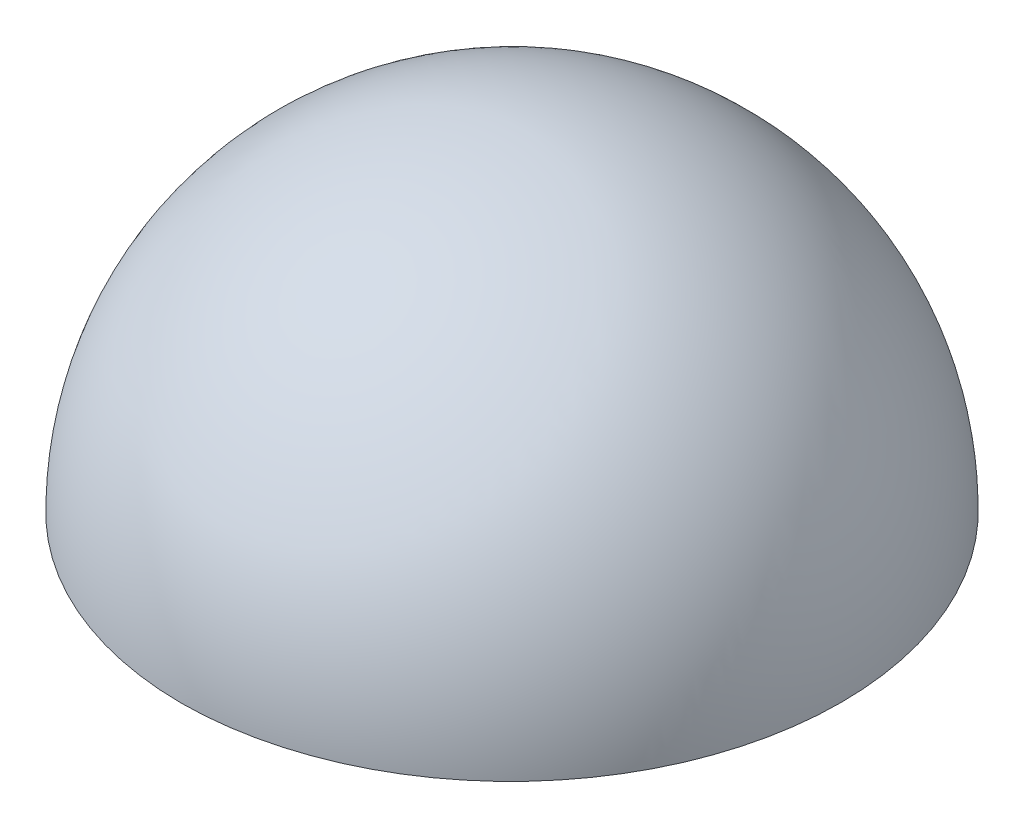
ISO-10303-21;
HEADER;
FILE_DESCRIPTION(('STEP AP214'),'2;1');
FILE_NAME('part.step','',(''),(''),'','','');
FILE_SCHEMA(('AUTOMOTIVE_DESIGN { 1 0 10303 214 1 1 1 1 }'));
ENDSEC;
DATA;
#1=APPLICATION_CONTEXT('core data for automotive mechanical design processes');
#2=APPLICATION_PROTOCOL_DEFINITION('international standard','automotive_design',2000,#1);
#3=PRODUCT_CONTEXT('',#1,'mechanical');
#4=PRODUCT('Part','Part','',(#3));
#5=PRODUCT_RELATED_PRODUCT_CATEGORY('part','',(#4));
#6=PRODUCT_DEFINITION_FORMATION('','',#4);
#7=PRODUCT_DEFINITION_CONTEXT('part definition',#1,'design');
#8=PRODUCT_DEFINITION('design','',#6,#7);
#9=PRODUCT_DEFINITION_SHAPE('','',#8);
#10=(LENGTH_UNIT() NAMED_UNIT(*) SI_UNIT(.MILLI.,.METRE.));
#11=(NAMED_UNIT(*) PLANE_ANGLE_UNIT() SI_UNIT($,.RADIAN.));
#12=(NAMED_UNIT(*) SI_UNIT($,.STERADIAN.) SOLID_ANGLE_UNIT());
#13=UNCERTAINTY_MEASURE_WITH_UNIT(LENGTH_MEASURE(1.E-05),#10,'distance_accuracy_value','');
#14=(GEOMETRIC_REPRESENTATION_CONTEXT(3) GLOBAL_UNCERTAINTY_ASSIGNED_CONTEXT((#13)) GLOBAL_UNIT_ASSIGNED_CONTEXT((#10,
#11,#12)) REPRESENTATION_CONTEXT('',''));
#15=CARTESIAN_POINT('',(0.,0.,0.));
#16=DIRECTION('',(0.,0.,1.));
#17=DIRECTION('',(1.,0.,0.));
#18=AXIS2_PLACEMENT_3D('',#15,#16,#17);
#19=CARTESIAN_POINT('',(0.232411953156538,0.,-0.281101360797663));
#20=DIRECTION('',(0.,-1.,0.));
#21=DIRECTION('',(-1.,0.,0.));
#22=AXIS2_PLACEMENT_3D('',#19,#20,#21);
#23=CIRCLE('',#22,35.);
#24=TRIMMED_CURVE('',#23,(PARAMETER_VALUE(-1.56635844452248)),
(PARAMETER_VALUE(1.56635844452248)),.T.,.PARAMETER.);
#25=CARTESIAN_POINT('',(0.077086583473383,0.,-0.281101360797662));
#26=DIRECTION('',(0.,0.,-1.));
#27=AXIS1_PLACEMENT('',#25,#26);
#28=SURFACE_OF_REVOLUTION('',#24,#27);
#29=CARTESIAN_POINT('',(-0.0782387862097722,0.,-0.281101360797661));
#30=DIRECTION('',(0.,-1.,0.));
#31=DIRECTION('',(0.,0.,1.));
#32=AXIS2_PLACEMENT_3D('',#29,#30,#31);
#33=CIRCLE('',#32,35.);
#34=CARTESIAN_POINT('',(0.0770865834732632,0.,-35.2807567023797));
#35=VERTEX_POINT('',#34);
#36=CARTESIAN_POINT('',(0.0770865834735021,0.,34.7185539807844));
#37=VERTEX_POINT('',#36);
#38=EDGE_CURVE('E50',#35,#37,#33,.T.);
#39=ORIENTED_EDGE('',*,*,#38,.T.);
#40=CARTESIAN_POINT('',(0.232411953156538,0.,-0.281101360797662));
#41=DIRECTION('',(0.,1.,0.));
#42=DIRECTION('',(0.,0.,1.));
#43=AXIS2_PLACEMENT_3D('',#40,#41,#42);
#44=CIRCLE('',#43,35.);
#45=EDGE_CURVE('E44',#35,#37,#44,.T.);
#46=ORIENTED_EDGE('',*,*,#45,.F.);
#47=EDGE_LOOP('',(#39,#46));
#48=FACE_BOUND('',#47,.T.);
#49=ADVANCED_FACE('F36',(#48),#28,.F.);
#50=CARTESIAN_POINT('',(0.232411953156539,0.,-0.222258143985626));
#51=DIRECTION('',(0.,-1.,0.));
#52=DIRECTION('',(-1.,0.,0.));
#53=AXIS2_PLACEMENT_3D('',#50,#51,#52);
#54=CIRCLE('',#53,37.);
#55=TRIMMED_CURVE('',#54,(PARAMETER_VALUE(-1.56659833150017)),
(PARAMETER_VALUE(1.56659833150017)),.T.,.PARAMETER.);
#56=CARTESIAN_POINT('',(0.0770865834733832,0.,-0.222258143985626));
#57=DIRECTION('',(0.,0.,-1.));
#58=AXIS1_PLACEMENT('',#56,#57);
#59=SURFACE_OF_REVOLUTION('',#55,#58);
#60=CARTESIAN_POINT('',(-0.0782387862097722,0.,-0.222258143985625));
#61=DIRECTION('',(0.,1.,0.));
#62=DIRECTION('',(0.,0.,1.));
#63=AXIS2_PLACEMENT_3D('',#60,#61,#62);
#64=CIRCLE('',#63,37.);
#65=CARTESIAN_POINT('',(0.0770865834735091,0.,36.77741582795));
#66=VERTEX_POINT('',#65);
#67=CARTESIAN_POINT('',(0.0770865834732566,0.,-37.2219321159213));
#68=VERTEX_POINT('',#67);
#69=EDGE_CURVE('E57',#66,#68,#64,.T.);
#70=ORIENTED_EDGE('',*,*,#69,.T.);
#71=CARTESIAN_POINT('',(0.232411953156539,0.,-0.222258143985626));
#72=DIRECTION('',(0.,-1.,0.));
#73=DIRECTION('',(0.,0.,1.));
#74=AXIS2_PLACEMENT_3D('',#71,#72,#73);
#75=CIRCLE('',#74,37.);
#76=EDGE_CURVE('E11',#66,#68,#75,.T.);
#77=ORIENTED_EDGE('',*,*,#76,.F.);
#78=EDGE_LOOP('',(#70,#77));
#79=FACE_BOUND('',#78,.T.);
#80=ADVANCED_FACE('F38',(#79),#59,.T.);
#81=CARTESIAN_POINT('',(0.232411953156538,0.,-0.281101360797662));
#82=DIRECTION('',(0.,-1.,0.));
#83=DIRECTION('',(0.,0.,1.));
#84=AXIS2_PLACEMENT_3D('',#81,#82,#83);
#85=PLANE('',#84);
#86=ORIENTED_EDGE('',*,*,#69,.F.);
#87=ORIENTED_EDGE('',*,*,#76,.T.);
#88=EDGE_LOOP('',(#86,#87));
#89=FACE_BOUND('',#88,.T.);
#90=ORIENTED_EDGE('',*,*,#45,.T.);
#91=ORIENTED_EDGE('',*,*,#38,.F.);
#92=EDGE_LOOP('',(#90,#91));
#93=FACE_BOUND('',#92,.T.);
#94=ADVANCED_FACE('F63',(#89,#93),#85,.T.);
#95=CLOSED_SHELL('',(#49,#80,#94));
#96=MANIFOLD_SOLID_BREP('B2',#95);
#97=ADVANCED_BREP_SHAPE_REPRESENTATION('',(#18,#96),#14);
#98=SHAPE_DEFINITION_REPRESENTATION(#9,#97);
ENDSEC;
END-ISO-10303-21;
